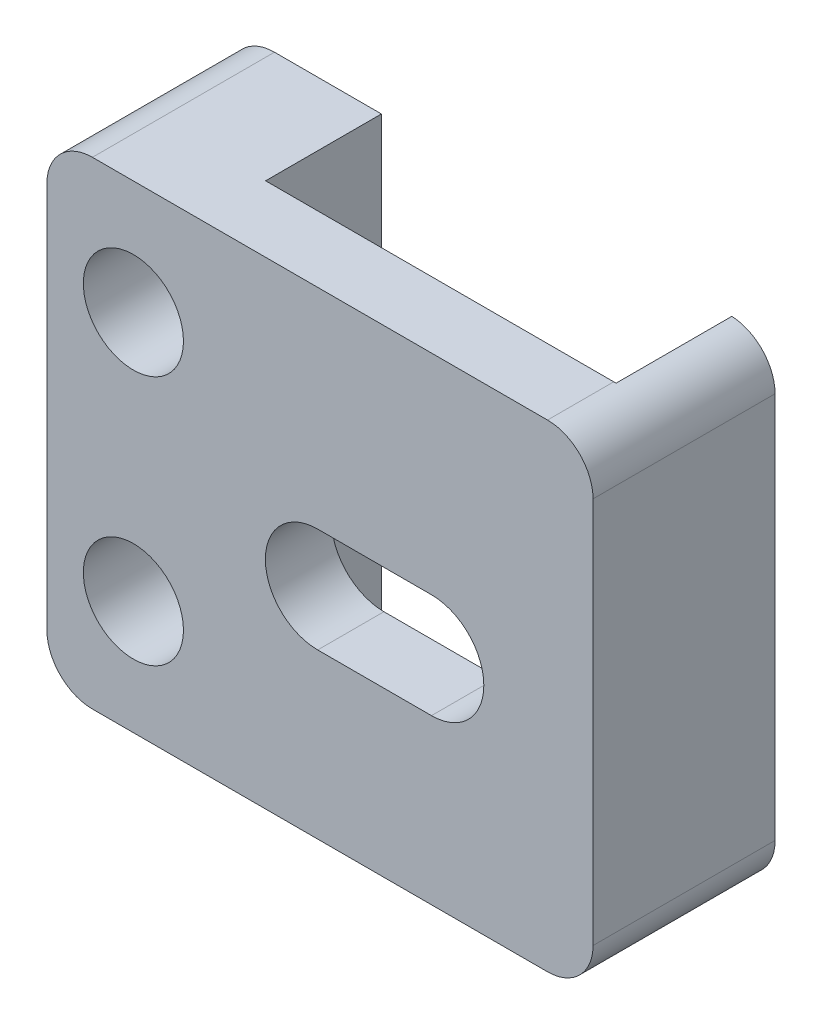
ISO-10303-21;
HEADER;
FILE_DESCRIPTION(('STEP AP214'),'2;1');
FILE_NAME('part.step','',(''),(''),'','','');
FILE_SCHEMA(('AUTOMOTIVE_DESIGN { 1 0 10303 214 1 1 1 1 }'));
ENDSEC;
DATA;
#1=APPLICATION_CONTEXT('core data for automotive mechanical design processes');
#2=APPLICATION_PROTOCOL_DEFINITION('international standard','automotive_design',2000,#1);
#3=PRODUCT_CONTEXT('',#1,'mechanical');
#4=PRODUCT('Part','Part','',(#3));
#5=PRODUCT_RELATED_PRODUCT_CATEGORY('part','',(#4));
#6=PRODUCT_DEFINITION_FORMATION('','',#4);
#7=PRODUCT_DEFINITION_CONTEXT('part definition',#1,'design');
#8=PRODUCT_DEFINITION('design','',#6,#7);
#9=PRODUCT_DEFINITION_SHAPE('','',#8);
#10=(LENGTH_UNIT() NAMED_UNIT(*) SI_UNIT(.MILLI.,.METRE.));
#11=(NAMED_UNIT(*) PLANE_ANGLE_UNIT() SI_UNIT($,.RADIAN.));
#12=(NAMED_UNIT(*) SI_UNIT($,.STERADIAN.) SOLID_ANGLE_UNIT());
#13=UNCERTAINTY_MEASURE_WITH_UNIT(LENGTH_MEASURE(1.E-05),#10,'distance_accuracy_value','');
#14=(GEOMETRIC_REPRESENTATION_CONTEXT(3) GLOBAL_UNCERTAINTY_ASSIGNED_CONTEXT((#13)) GLOBAL_UNIT_ASSIGNED_CONTEXT((#10,
#11,#12)) REPRESENTATION_CONTEXT('',''));
#15=CARTESIAN_POINT('',(0.,0.,0.));
#16=DIRECTION('',(0.,0.,1.));
#17=DIRECTION('',(1.,0.,0.));
#18=AXIS2_PLACEMENT_3D('',#15,#16,#17);
#19=CARTESIAN_POINT('',(0.,10.5,4.));
#20=DIRECTION('',(0.,0.,-1.));
#21=DIRECTION('',(-1.,0.,0.));
#22=AXIS2_PLACEMENT_3D('',#19,#20,#21);
#23=PLANE('',#22);
#24=DIRECTION('',(1.,0.,0.));
#25=VECTOR('',#24,1.);
#26=CARTESIAN_POINT('',(3.45,3.6,4.));
#27=LINE('',#26,#25);
#28=CARTESIAN_POINT('',(3.45,3.6,4.));
#29=VERTEX_POINT('',#28);
#30=CARTESIAN_POINT('',(5.95,3.6,4.));
#31=VERTEX_POINT('',#30);
#32=EDGE_CURVE('E157',#29,#31,#27,.T.);
#33=ORIENTED_EDGE('',*,*,#32,.F.);
#34=CARTESIAN_POINT('',(3.45,4.75,4.));
#35=DIRECTION('',(0.,0.,1.));
#36=DIRECTION('',(1.,0.,0.));
#37=AXIS2_PLACEMENT_3D('',#34,#35,#36);
#38=CIRCLE('',#37,1.15);
#39=CARTESIAN_POINT('',(3.45,5.9,4.));
#40=VERTEX_POINT('',#39);
#41=EDGE_CURVE('E47',#40,#29,#38,.T.);
#42=ORIENTED_EDGE('',*,*,#41,.F.);
#43=DIRECTION('',(-1.,0.,0.));
#44=VECTOR('',#43,1.);
#45=CARTESIAN_POINT('',(3.45,5.9,4.));
#46=LINE('',#45,#44);
#47=CARTESIAN_POINT('',(5.95,5.9,4.));
#48=VERTEX_POINT('',#47);
#49=EDGE_CURVE('E163',#48,#40,#46,.T.);
#50=ORIENTED_EDGE('',*,*,#49,.F.);
#51=CARTESIAN_POINT('',(5.95,4.75,4.));
#52=DIRECTION('',(0.,0.,1.));
#53=DIRECTION('',(1.,0.,0.));
#54=AXIS2_PLACEMENT_3D('',#51,#52,#53);
#55=CIRCLE('',#54,1.15);
#56=EDGE_CURVE('E148',#31,#48,#55,.T.);
#57=ORIENTED_EDGE('',*,*,#56,.F.);
#58=EDGE_LOOP('',(#33,#42,#50,#57));
#59=FACE_BOUND('',#58,.T.);
#60=CARTESIAN_POINT('',(-0.6,8.,4.));
#61=DIRECTION('',(0.,0.,1.));
#62=DIRECTION('',(1.,0.,0.));
#63=AXIS2_PLACEMENT_3D('',#60,#61,#62);
#64=CIRCLE('',#63,1.10000000000001);
#65=CARTESIAN_POINT('',(0.500000000000014,8.,4.));
#66=VERTEX_POINT('',#65);
#67=EDGE_CURVE('E175',#66,#66,#64,.T.);
#68=ORIENTED_EDGE('',*,*,#67,.F.);
#69=EDGE_LOOP('',(#68));
#70=FACE_BOUND('',#69,.T.);
#71=CARTESIAN_POINT('',(-0.6,2.5,4.));
#72=DIRECTION('',(0.,0.,1.));
#73=DIRECTION('',(1.,0.,0.));
#74=AXIS2_PLACEMENT_3D('',#71,#72,#73);
#75=CIRCLE('',#74,1.10000000000001);
#76=CARTESIAN_POINT('',(0.500000000000014,2.5,4.));
#77=VERTEX_POINT('',#76);
#78=EDGE_CURVE('E198',#77,#77,#75,.T.);
#79=ORIENTED_EDGE('',*,*,#78,.F.);
#80=EDGE_LOOP('',(#79));
#81=FACE_BOUND('',#80,.T.);
#82=DIRECTION('',(1.,0.,0.));
#83=VECTOR('',#82,1.);
#84=CARTESIAN_POINT('',(0.,0.,4.));
#85=LINE('',#84,#83);
#86=CARTESIAN_POINT('',(-1.5,0.,4.));
#87=VERTEX_POINT('',#86);
#88=CARTESIAN_POINT('',(8.5,0.,4.));
#89=VERTEX_POINT('',#88);
#90=EDGE_CURVE('E212',#87,#89,#85,.T.);
#91=ORIENTED_EDGE('',*,*,#90,.T.);
#92=CARTESIAN_POINT('',(8.5,0.999999999999999,4.));
#93=DIRECTION('',(0.,0.,-1.));
#94=DIRECTION('',(-1.,0.,0.));
#95=AXIS2_PLACEMENT_3D('',#92,#93,#94);
#96=CIRCLE('',#95,1.);
#97=CARTESIAN_POINT('',(9.5,1.,4.));
#98=VERTEX_POINT('',#97);
#99=EDGE_CURVE('E253',#89,#98,#96,.F.);
#100=ORIENTED_EDGE('',*,*,#99,.T.);
#101=DIRECTION('',(0.,-1.,0.));
#102=VECTOR('',#101,1.);
#103=CARTESIAN_POINT('',(9.5,10.5,4.));
#104=LINE('',#103,#102);
#105=CARTESIAN_POINT('',(9.5,9.5,4.));
#106=VERTEX_POINT('',#105);
#107=EDGE_CURVE('E226',#106,#98,#104,.T.);
#108=ORIENTED_EDGE('',*,*,#107,.F.);
#109=CARTESIAN_POINT('',(8.5,9.5,4.));
#110=DIRECTION('',(0.,0.,-1.));
#111=DIRECTION('',(-1.,0.,0.));
#112=AXIS2_PLACEMENT_3D('',#109,#110,#111);
#113=CIRCLE('',#112,1.);
#114=CARTESIAN_POINT('',(8.5,10.5,4.));
#115=VERTEX_POINT('',#114);
#116=EDGE_CURVE('E247',#106,#115,#113,.F.);
#117=ORIENTED_EDGE('',*,*,#116,.T.);
#118=DIRECTION('',(1.,0.,0.));
#119=VECTOR('',#118,1.);
#120=CARTESIAN_POINT('',(0.,10.5,4.));
#121=LINE('',#120,#119);
#122=CARTESIAN_POINT('',(-1.5,10.5,4.));
#123=VERTEX_POINT('',#122);
#124=EDGE_CURVE('E213',#123,#115,#121,.T.);
#125=ORIENTED_EDGE('',*,*,#124,.F.);
#126=CARTESIAN_POINT('',(-1.5,9.5,4.));
#127=DIRECTION('',(0.,0.,-1.));
#128=DIRECTION('',(-1.,0.,0.));
#129=AXIS2_PLACEMENT_3D('',#126,#127,#128);
#130=CIRCLE('',#129,1.);
#131=CARTESIAN_POINT('',(-2.5,9.5,4.));
#132=VERTEX_POINT('',#131);
#133=EDGE_CURVE('E249',#123,#132,#130,.F.);
#134=ORIENTED_EDGE('',*,*,#133,.T.);
#135=DIRECTION('',(0.,1.,0.));
#136=VECTOR('',#135,1.);
#137=CARTESIAN_POINT('',(-2.5,10.5,4.));
#138=LINE('',#137,#136);
#139=CARTESIAN_POINT('',(-2.5,1.,4.));
#140=VERTEX_POINT('',#139);
#141=EDGE_CURVE('E207',#140,#132,#138,.T.);
#142=ORIENTED_EDGE('',*,*,#141,.F.);
#143=CARTESIAN_POINT('',(-1.5,1.,4.));
#144=DIRECTION('',(0.,0.,-1.));
#145=DIRECTION('',(-1.,0.,0.));
#146=AXIS2_PLACEMENT_3D('',#143,#144,#145);
#147=CIRCLE('',#146,1.);
#148=EDGE_CURVE('E251',#140,#87,#147,.F.);
#149=ORIENTED_EDGE('',*,*,#148,.T.);
#150=EDGE_LOOP('',(#91,#100,#108,#117,#125,#134,#142,#149));
#151=FACE_BOUND('',#150,.T.);
#152=ADVANCED_FACE('F32',(#59,#70,#81,#151),#23,.F.);
#153=CARTESIAN_POINT('',(9.5,10.5,0.));
#154=DIRECTION('',(-1.,0.,0.));
#155=DIRECTION('',(0.,0.,1.));
#156=AXIS2_PLACEMENT_3D('',#153,#154,#155);
#157=PLANE('',#156);
#158=ORIENTED_EDGE('',*,*,#107,.T.);
#159=DIRECTION('',(0.,0.,-1.));
#160=VECTOR('',#159,1.);
#161=CARTESIAN_POINT('',(9.5,0.999999999999999,0.));
#162=LINE('',#161,#160);
#163=CARTESIAN_POINT('',(9.5,1.,0.));
#164=VERTEX_POINT('',#163);
#165=EDGE_CURVE('E231',#98,#164,#162,.T.);
#166=ORIENTED_EDGE('',*,*,#165,.T.);
#167=DIRECTION('',(0.,-1.,0.));
#168=VECTOR('',#167,1.);
#169=CARTESIAN_POINT('',(9.5,10.5,0.));
#170=LINE('',#169,#168);
#171=CARTESIAN_POINT('',(9.5,9.5,0.));
#172=VERTEX_POINT('',#171);
#173=EDGE_CURVE('E219',#172,#164,#170,.T.);
#174=ORIENTED_EDGE('',*,*,#173,.F.);
#175=DIRECTION('',(0.,0.,-1.));
#176=VECTOR('',#175,1.);
#177=CARTESIAN_POINT('',(9.5,9.5,4.));
#178=LINE('',#177,#176);
#179=EDGE_CURVE('E229',#172,#106,#178,.F.);
#180=ORIENTED_EDGE('',*,*,#179,.T.);
#181=EDGE_LOOP('',(#158,#166,#174,#180));
#182=FACE_BOUND('',#181,.T.);
#183=ADVANCED_FACE('F296',(#182),#157,.F.);
#184=CARTESIAN_POINT('',(0.,10.5,0.));
#185=DIRECTION('',(0.,0.,1.));
#186=DIRECTION('',(1.,0.,0.));
#187=AXIS2_PLACEMENT_3D('',#184,#185,#186);
#188=PLANE('',#187);
#189=CARTESIAN_POINT('',(-0.6,8.,0.));
#190=DIRECTION('',(0.,0.,1.));
#191=DIRECTION('',(1.,0.,0.));
#192=AXIS2_PLACEMENT_3D('',#189,#190,#191);
#193=CIRCLE('',#192,1.10000000000001);
#194=CARTESIAN_POINT('',(0.500000000000013,8.,0.));
#195=VERTEX_POINT('',#194);
#196=EDGE_CURVE('E195',#195,#195,#193,.T.);
#197=ORIENTED_EDGE('',*,*,#196,.T.);
#198=EDGE_LOOP('',(#197));
#199=FACE_BOUND('',#198,.T.);
#200=CARTESIAN_POINT('',(-0.6,2.5,0.));
#201=DIRECTION('',(0.,0.,1.));
#202=DIRECTION('',(1.,0.,0.));
#203=AXIS2_PLACEMENT_3D('',#200,#201,#202);
#204=CIRCLE('',#203,1.10000000000001);
#205=CARTESIAN_POINT('',(0.500000000000013,2.5,0.));
#206=VERTEX_POINT('',#205);
#207=EDGE_CURVE('E201',#206,#206,#204,.T.);
#208=ORIENTED_EDGE('',*,*,#207,.T.);
#209=EDGE_LOOP('',(#208));
#210=FACE_BOUND('',#209,.T.);
#211=DIRECTION('',(-1.,0.,0.));
#212=VECTOR('',#211,1.);
#213=CARTESIAN_POINT('',(0.,10.5,0.));
#214=LINE('',#213,#212);
#215=CARTESIAN_POINT('',(0.85,10.5,0.));
#216=VERTEX_POINT('',#215);
#217=CARTESIAN_POINT('',(-1.5,10.5,0.));
#218=VERTEX_POINT('',#217);
#219=EDGE_CURVE('E216',#216,#218,#214,.T.);
#220=ORIENTED_EDGE('',*,*,#219,.F.);
#221=DIRECTION('',(0.,1.,0.));
#222=VECTOR('',#221,1.);
#223=CARTESIAN_POINT('',(0.85,0.700000000000001,0.));
#224=LINE('',#223,#222);
#225=CARTESIAN_POINT('',(0.85,0.700000000000001,0.));
#226=VERTEX_POINT('',#225);
#227=EDGE_CURVE('E173',#226,#216,#224,.T.);
#228=ORIENTED_EDGE('',*,*,#227,.F.);
#229=DIRECTION('',(-1.,0.,0.));
#230=VECTOR('',#229,1.);
#231=CARTESIAN_POINT('',(8.55,0.700000000000001,0.));
#232=LINE('',#231,#230);
#233=CARTESIAN_POINT('',(8.55,0.700000000000001,0.));
#234=VERTEX_POINT('',#233);
#235=EDGE_CURVE('E176',#234,#226,#232,.T.);
#236=ORIENTED_EDGE('',*,*,#235,.F.);
#237=DIRECTION('',(0.,-1.,0.));
#238=VECTOR('',#237,1.);
#239=CARTESIAN_POINT('',(8.55,10.8,0.));
#240=LINE('',#239,#238);
#241=CARTESIAN_POINT('',(8.55,10.4987492177719,0.));
#242=VERTEX_POINT('',#241);
#243=EDGE_CURVE('E179',#242,#234,#240,.T.);
#244=ORIENTED_EDGE('',*,*,#243,.F.);
#245=CARTESIAN_POINT('',(8.5,9.5,0.));
#246=DIRECTION('',(0.,0.,1.));
#247=DIRECTION('',(1.,0.,0.));
#248=AXIS2_PLACEMENT_3D('',#245,#246,#247);
#249=CIRCLE('',#248,1.);
#250=EDGE_CURVE('E234',#242,#172,#249,.F.);
#251=ORIENTED_EDGE('',*,*,#250,.T.);
#252=ORIENTED_EDGE('',*,*,#173,.T.);
#253=CARTESIAN_POINT('',(8.5,0.999999999999999,0.));
#254=DIRECTION('',(0.,0.,1.));
#255=DIRECTION('',(1.,0.,0.));
#256=AXIS2_PLACEMENT_3D('',#253,#254,#255);
#257=CIRCLE('',#256,1.);
#258=CARTESIAN_POINT('',(8.5,0.,0.));
#259=VERTEX_POINT('',#258);
#260=EDGE_CURVE('E241',#164,#259,#257,.F.);
#261=ORIENTED_EDGE('',*,*,#260,.T.);
#262=DIRECTION('',(-1.,0.,0.));
#263=VECTOR('',#262,1.);
#264=CARTESIAN_POINT('',(0.,0.,0.));
#265=LINE('',#264,#263);
#266=CARTESIAN_POINT('',(-1.5,0.,0.));
#267=VERTEX_POINT('',#266);
#268=EDGE_CURVE('E217',#259,#267,#265,.T.);
#269=ORIENTED_EDGE('',*,*,#268,.T.);
#270=CARTESIAN_POINT('',(-1.5,1.,0.));
#271=DIRECTION('',(0.,0.,1.));
#272=DIRECTION('',(1.,0.,0.));
#273=AXIS2_PLACEMENT_3D('',#270,#271,#272);
#274=CIRCLE('',#273,1.);
#275=CARTESIAN_POINT('',(-2.5,1.,0.));
#276=VERTEX_POINT('',#275);
#277=EDGE_CURVE('E239',#267,#276,#274,.F.);
#278=ORIENTED_EDGE('',*,*,#277,.T.);
#279=DIRECTION('',(0.,-1.,0.));
#280=VECTOR('',#279,1.);
#281=CARTESIAN_POINT('',(-2.5,10.5,0.));
#282=LINE('',#281,#280);
#283=CARTESIAN_POINT('',(-2.5,9.5,0.));
#284=VERTEX_POINT('',#283);
#285=EDGE_CURVE('E204',#284,#276,#282,.T.);
#286=ORIENTED_EDGE('',*,*,#285,.F.);
#287=CARTESIAN_POINT('',(-1.5,9.5,0.));
#288=DIRECTION('',(0.,0.,1.));
#289=DIRECTION('',(1.,0.,0.));
#290=AXIS2_PLACEMENT_3D('',#287,#288,#289);
#291=CIRCLE('',#290,1.);
#292=EDGE_CURVE('E236',#284,#218,#291,.F.);
#293=ORIENTED_EDGE('',*,*,#292,.T.);
#294=EDGE_LOOP('',(#220,#228,#236,#244,#251,#252,#261,#269,#278,#286,#293));
#295=FACE_BOUND('',#294,.T.);
#296=ADVANCED_FACE('F301',(#199,#210,#295),#188,.F.);
#297=CARTESIAN_POINT('',(0.,10.5,0.));
#298=DIRECTION('',(0.,1.,0.));
#299=DIRECTION('',(0.,0.,1.));
#300=AXIS2_PLACEMENT_3D('',#297,#298,#299);
#301=PLANE('',#300);
#302=DIRECTION('',(0.,0.,1.));
#303=VECTOR('',#302,1.);
#304=CARTESIAN_POINT('',(0.85,10.5,0.));
#305=LINE('',#304,#303);
#306=CARTESIAN_POINT('',(0.85,10.5,2.54483655126592));
#307=VERTEX_POINT('',#306);
#308=EDGE_CURVE('E270',#216,#307,#305,.T.);
#309=ORIENTED_EDGE('',*,*,#308,.F.);
#310=ORIENTED_EDGE('',*,*,#219,.T.);
#311=DIRECTION('',(0.,0.,-1.));
#312=VECTOR('',#311,1.);
#313=CARTESIAN_POINT('',(-1.5,10.5,0.));
#314=LINE('',#313,#312);
#315=EDGE_CURVE('E264',#218,#123,#314,.F.);
#316=ORIENTED_EDGE('',*,*,#315,.T.);
#317=ORIENTED_EDGE('',*,*,#124,.T.);
#318=DIRECTION('',(0.,0.,-1.));
#319=VECTOR('',#318,1.);
#320=CARTESIAN_POINT('',(8.5,10.5,0.));
#321=LINE('',#320,#319);
#322=CARTESIAN_POINT('',(8.5,10.5,2.54483655126592));
#323=VERTEX_POINT('',#322);
#324=EDGE_CURVE('E261',#115,#323,#321,.T.);
#325=ORIENTED_EDGE('',*,*,#324,.T.);
#326=DIRECTION('',(1.,0.,0.));
#327=VECTOR('',#326,1.);
#328=CARTESIAN_POINT('',(8.25,10.5,2.54483655126592));
#329=LINE('',#328,#327);
#330=EDGE_CURVE('E210',#307,#323,#329,.T.);
#331=ORIENTED_EDGE('',*,*,#330,.F.);
#332=EDGE_LOOP('',(#309,#310,#316,#317,#325,#331));
#333=FACE_BOUND('',#332,.T.);
#334=ADVANCED_FACE('F350',(#333),#301,.T.);
#335=CARTESIAN_POINT('',(0.,0.,0.));
#336=DIRECTION('',(0.,1.,0.));
#337=DIRECTION('',(0.,0.,1.));
#338=AXIS2_PLACEMENT_3D('',#335,#336,#337);
#339=PLANE('',#338);
#340=ORIENTED_EDGE('',*,*,#268,.F.);
#341=DIRECTION('',(0.,0.,-1.));
#342=VECTOR('',#341,1.);
#343=CARTESIAN_POINT('',(8.5,0.,0.));
#344=LINE('',#343,#342);
#345=EDGE_CURVE('E245',#259,#89,#344,.F.);
#346=ORIENTED_EDGE('',*,*,#345,.T.);
#347=ORIENTED_EDGE('',*,*,#90,.F.);
#348=DIRECTION('',(0.,0.,1.));
#349=VECTOR('',#348,1.);
#350=CARTESIAN_POINT('',(-1.5,0.,0.));
#351=LINE('',#350,#349);
#352=EDGE_CURVE('E243',#87,#267,#351,.F.);
#353=ORIENTED_EDGE('',*,*,#352,.T.);
#354=EDGE_LOOP('',(#340,#346,#347,#353));
#355=FACE_BOUND('',#354,.T.);
#356=ADVANCED_FACE('F337',(#355),#339,.F.);
#357=CARTESIAN_POINT('',(8.25,1.,2.54483655126592));
#358=DIRECTION('',(0.,0.,1.));
#359=DIRECTION('',(1.,0.,0.));
#360=AXIS2_PLACEMENT_3D('',#357,#358,#359);
#361=PLANE('',#360);
#362=DIRECTION('',(-1.,0.,0.));
#363=VECTOR('',#362,1.);
#364=CARTESIAN_POINT('',(8.25,5.9,2.54483655126592));
#365=LINE('',#364,#363);
#366=CARTESIAN_POINT('',(5.95,5.9,2.54483655126592));
#367=VERTEX_POINT('',#366);
#368=CARTESIAN_POINT('',(3.45,5.9,2.54483655126592));
#369=VERTEX_POINT('',#368);
#370=EDGE_CURVE('E40',#367,#369,#365,.T.);
#371=ORIENTED_EDGE('',*,*,#370,.T.);
#372=CARTESIAN_POINT('',(3.45,4.75,2.54483655126592));
#373=DIRECTION('',(0.,0.,1.));
#374=DIRECTION('',(1.,0.,0.));
#375=AXIS2_PLACEMENT_3D('',#372,#373,#374);
#376=CIRCLE('',#375,1.15);
#377=CARTESIAN_POINT('',(3.45,3.6,2.54483655126592));
#378=VERTEX_POINT('',#377);
#379=EDGE_CURVE('E11',#369,#378,#376,.T.);
#380=ORIENTED_EDGE('',*,*,#379,.T.);
#381=DIRECTION('',(1.,0.,0.));
#382=VECTOR('',#381,1.);
#383=CARTESIAN_POINT('',(8.25,3.6,2.54483655126592));
#384=LINE('',#383,#382);
#385=CARTESIAN_POINT('',(5.95,3.6,2.54483655126592));
#386=VERTEX_POINT('',#385);
#387=EDGE_CURVE('E273',#378,#386,#384,.T.);
#388=ORIENTED_EDGE('',*,*,#387,.T.);
#389=CARTESIAN_POINT('',(5.95,4.75,2.54483655126592));
#390=DIRECTION('',(0.,0.,1.));
#391=DIRECTION('',(1.,0.,0.));
#392=AXIS2_PLACEMENT_3D('',#389,#390,#391);
#393=CIRCLE('',#392,1.15);
#394=EDGE_CURVE('E151',#386,#367,#393,.T.);
#395=ORIENTED_EDGE('',*,*,#394,.T.);
#396=EDGE_LOOP('',(#371,#380,#388,#395));
#397=FACE_BOUND('',#396,.T.);
#398=ORIENTED_EDGE('',*,*,#330,.T.);
#399=CARTESIAN_POINT('',(8.5,9.5,2.54483655126592));
#400=DIRECTION('',(0.,0.,1.));
#401=DIRECTION('',(1.,0.,0.));
#402=AXIS2_PLACEMENT_3D('',#399,#400,#401);
#403=CIRCLE('',#402,1.);
#404=CARTESIAN_POINT('',(8.55,10.4987492177719,2.54483655126592));
#405=VERTEX_POINT('',#404);
#406=EDGE_CURVE('E266',#323,#405,#403,.F.);
#407=ORIENTED_EDGE('',*,*,#406,.T.);
#408=DIRECTION('',(0.,-1.,0.));
#409=VECTOR('',#408,1.);
#410=CARTESIAN_POINT('',(8.55,10.8,2.54483655126592));
#411=LINE('',#410,#409);
#412=CARTESIAN_POINT('',(8.55,0.700000000000001,2.54483655126592));
#413=VERTEX_POINT('',#412);
#414=EDGE_CURVE('E182',#405,#413,#411,.T.);
#415=ORIENTED_EDGE('',*,*,#414,.T.);
#416=DIRECTION('',(-1.,0.,0.));
#417=VECTOR('',#416,1.);
#418=CARTESIAN_POINT('',(8.55,0.700000000000001,2.54483655126592));
#419=LINE('',#418,#417);
#420=CARTESIAN_POINT('',(0.85,0.700000000000001,2.54483655126592));
#421=VERTEX_POINT('',#420);
#422=EDGE_CURVE('E187',#413,#421,#419,.T.);
#423=ORIENTED_EDGE('',*,*,#422,.T.);
#424=DIRECTION('',(0.,1.,0.));
#425=VECTOR('',#424,1.);
#426=CARTESIAN_POINT('',(0.85,0.700000000000001,2.54483655126592));
#427=LINE('',#426,#425);
#428=EDGE_CURVE('E170',#421,#307,#427,.T.);
#429=ORIENTED_EDGE('',*,*,#428,.T.);
#430=EDGE_LOOP('',(#398,#407,#415,#423,#429));
#431=FACE_BOUND('',#430,.T.);
#432=ADVANCED_FACE('F277',(#397,#431),#361,.F.);
#433=CARTESIAN_POINT('',(-2.5,0.,0.));
#434=DIRECTION('',(-1.,0.,0.));
#435=DIRECTION('',(0.,0.,1.));
#436=AXIS2_PLACEMENT_3D('',#433,#434,#435);
#437=PLANE('',#436);
#438=ORIENTED_EDGE('',*,*,#285,.T.);
#439=DIRECTION('',(0.,0.,1.));
#440=VECTOR('',#439,1.);
#441=CARTESIAN_POINT('',(-2.5,1.,4.));
#442=LINE('',#441,#440);
#443=EDGE_CURVE('E258',#276,#140,#442,.T.);
#444=ORIENTED_EDGE('',*,*,#443,.T.);
#445=ORIENTED_EDGE('',*,*,#141,.T.);
#446=DIRECTION('',(0.,0.,-1.));
#447=VECTOR('',#446,1.);
#448=CARTESIAN_POINT('',(-2.5,9.5,0.));
#449=LINE('',#448,#447);
#450=EDGE_CURVE('E255',#132,#284,#449,.T.);
#451=ORIENTED_EDGE('',*,*,#450,.T.);
#452=EDGE_LOOP('',(#438,#444,#445,#451));
#453=FACE_BOUND('',#452,.T.);
#454=ADVANCED_FACE('F310',(#453),#437,.T.);
#455=CARTESIAN_POINT('',(8.5,0.999999999999999,0.));
#456=DIRECTION('',(0.,0.,-1.));
#457=DIRECTION('',(-1.,0.,0.));
#458=AXIS2_PLACEMENT_3D('',#455,#456,#457);
#459=CYLINDRICAL_SURFACE('',#458,1.);
#460=ORIENTED_EDGE('',*,*,#99,.F.);
#461=ORIENTED_EDGE('',*,*,#345,.F.);
#462=ORIENTED_EDGE('',*,*,#260,.F.);
#463=ORIENTED_EDGE('',*,*,#165,.F.);
#464=EDGE_LOOP('',(#460,#461,#462,#463));
#465=FACE_BOUND('',#464,.T.);
#466=ADVANCED_FACE('F306',(#465),#459,.T.);
#467=CARTESIAN_POINT('',(-1.5,1.,0.));
#468=DIRECTION('',(0.,0.,-1.));
#469=DIRECTION('',(-1.,0.,0.));
#470=AXIS2_PLACEMENT_3D('',#467,#468,#469);
#471=CYLINDRICAL_SURFACE('',#470,1.);
#472=ORIENTED_EDGE('',*,*,#277,.F.);
#473=ORIENTED_EDGE('',*,*,#352,.F.);
#474=ORIENTED_EDGE('',*,*,#148,.F.);
#475=ORIENTED_EDGE('',*,*,#443,.F.);
#476=EDGE_LOOP('',(#472,#473,#474,#475));
#477=FACE_BOUND('',#476,.T.);
#478=ADVANCED_FACE('F309',(#477),#471,.T.);
#479=CARTESIAN_POINT('',(-1.5,9.5,0.));
#480=DIRECTION('',(0.,0.,-1.));
#481=DIRECTION('',(-1.,0.,0.));
#482=AXIS2_PLACEMENT_3D('',#479,#480,#481);
#483=CYLINDRICAL_SURFACE('',#482,1.);
#484=ORIENTED_EDGE('',*,*,#133,.F.);
#485=ORIENTED_EDGE('',*,*,#315,.F.);
#486=ORIENTED_EDGE('',*,*,#292,.F.);
#487=ORIENTED_EDGE('',*,*,#450,.F.);
#488=EDGE_LOOP('',(#484,#485,#486,#487));
#489=FACE_BOUND('',#488,.T.);
#490=ADVANCED_FACE('F313',(#489),#483,.T.);
#491=CARTESIAN_POINT('',(8.5,9.5,0.));
#492=DIRECTION('',(0.,0.,1.));
#493=DIRECTION('',(1.,0.,0.));
#494=AXIS2_PLACEMENT_3D('',#491,#492,#493);
#495=CYLINDRICAL_SURFACE('',#494,1.);
#496=DIRECTION('',(0.,0.,1.));
#497=VECTOR('',#496,1.);
#498=CARTESIAN_POINT('',(8.55,10.4987492177719,0.));
#499=LINE('',#498,#497);
#500=EDGE_CURVE('E268',#405,#242,#499,.F.);
#501=ORIENTED_EDGE('',*,*,#500,.F.);
#502=ORIENTED_EDGE('',*,*,#406,.F.);
#503=ORIENTED_EDGE('',*,*,#324,.F.);
#504=ORIENTED_EDGE('',*,*,#116,.F.);
#505=ORIENTED_EDGE('',*,*,#179,.F.);
#506=ORIENTED_EDGE('',*,*,#250,.F.);
#507=EDGE_LOOP('',(#501,#502,#503,#504,#505,#506));
#508=FACE_BOUND('',#507,.T.);
#509=ADVANCED_FACE('F34',(#508),#495,.T.);
#510=CARTESIAN_POINT('',(-0.6,2.5,4.));
#511=DIRECTION('',(0.,0.,1.));
#512=DIRECTION('',(1.,0.,0.));
#513=AXIS2_PLACEMENT_3D('',#510,#511,#512);
#514=CYLINDRICAL_SURFACE('',#513,1.10000000000001);
#515=ORIENTED_EDGE('',*,*,#207,.F.);
#516=EDGE_LOOP('',(#515));
#517=FACE_BOUND('',#516,.T.);
#518=ORIENTED_EDGE('',*,*,#78,.T.);
#519=EDGE_LOOP('',(#518));
#520=FACE_BOUND('',#519,.T.);
#521=ADVANCED_FACE('F320',(#517,#520),#514,.F.);
#522=CARTESIAN_POINT('',(-0.6,8.,4.));
#523=DIRECTION('',(0.,0.,1.));
#524=DIRECTION('',(1.,0.,0.));
#525=AXIS2_PLACEMENT_3D('',#522,#523,#524);
#526=CYLINDRICAL_SURFACE('',#525,1.10000000000001);
#527=ORIENTED_EDGE('',*,*,#196,.F.);
#528=EDGE_LOOP('',(#527));
#529=FACE_BOUND('',#528,.T.);
#530=ORIENTED_EDGE('',*,*,#67,.T.);
#531=EDGE_LOOP('',(#530));
#532=FACE_BOUND('',#531,.T.);
#533=ADVANCED_FACE('F364',(#529,#532),#526,.F.);
#534=CARTESIAN_POINT('',(0.85,0.700000000000001,15.2452302459511));
#535=DIRECTION('',(-1.,0.,0.));
#536=DIRECTION('',(0.,0.,1.));
#537=AXIS2_PLACEMENT_3D('',#534,#535,#536);
#538=PLANE('',#537);
#539=ORIENTED_EDGE('',*,*,#308,.T.);
#540=ORIENTED_EDGE('',*,*,#428,.F.);
#541=DIRECTION('',(0.,0.,-1.));
#542=VECTOR('',#541,1.);
#543=CARTESIAN_POINT('',(0.85,0.700000000000001,15.2452302459511));
#544=LINE('',#543,#542);
#545=EDGE_CURVE('E184',#421,#226,#544,.T.);
#546=ORIENTED_EDGE('',*,*,#545,.T.);
#547=ORIENTED_EDGE('',*,*,#227,.T.);
#548=EDGE_LOOP('',(#539,#540,#546,#547));
#549=FACE_BOUND('',#548,.T.);
#550=ADVANCED_FACE('F362',(#549),#538,.F.);
#551=CARTESIAN_POINT('',(8.55,0.700000000000001,15.2452302459511));
#552=DIRECTION('',(0.,-1.,0.));
#553=DIRECTION('',(0.,0.,-1.));
#554=AXIS2_PLACEMENT_3D('',#551,#552,#553);
#555=PLANE('',#554);
#556=DIRECTION('',(0.,0.,-1.));
#557=VECTOR('',#556,1.);
#558=CARTESIAN_POINT('',(8.55,0.700000000000001,15.2452302459511));
#559=LINE('',#558,#557);
#560=EDGE_CURVE('E181',#413,#234,#559,.T.);
#561=ORIENTED_EDGE('',*,*,#560,.T.);
#562=ORIENTED_EDGE('',*,*,#235,.T.);
#563=ORIENTED_EDGE('',*,*,#545,.F.);
#564=ORIENTED_EDGE('',*,*,#422,.F.);
#565=EDGE_LOOP('',(#561,#562,#563,#564));
#566=FACE_BOUND('',#565,.T.);
#567=ADVANCED_FACE('F291',(#566),#555,.F.);
#568=CARTESIAN_POINT('',(8.55,10.8,15.2452302459511));
#569=DIRECTION('',(1.,0.,0.));
#570=DIRECTION('',(0.,0.,-1.));
#571=AXIS2_PLACEMENT_3D('',#568,#569,#570);
#572=PLANE('',#571);
#573=ORIENTED_EDGE('',*,*,#500,.T.);
#574=ORIENTED_EDGE('',*,*,#243,.T.);
#575=ORIENTED_EDGE('',*,*,#560,.F.);
#576=ORIENTED_EDGE('',*,*,#414,.F.);
#577=EDGE_LOOP('',(#573,#574,#575,#576));
#578=FACE_BOUND('',#577,.T.);
#579=ADVANCED_FACE('F284',(#578),#572,.F.);
#580=CARTESIAN_POINT('',(3.45,4.75,2.54));
#581=DIRECTION('',(0.,0.,1.));
#582=DIRECTION('',(1.,0.,0.));
#583=AXIS2_PLACEMENT_3D('',#580,#581,#582);
#584=CYLINDRICAL_SURFACE('',#583,1.15);
#585=DIRECTION('',(0.,0.,1.));
#586=VECTOR('',#585,1.);
#587=CARTESIAN_POINT('',(3.45,5.9,2.54));
#588=LINE('',#587,#586);
#589=EDGE_CURVE('E168',#369,#40,#588,.T.);
#590=ORIENTED_EDGE('',*,*,#589,.T.);
#591=ORIENTED_EDGE('',*,*,#41,.T.);
#592=DIRECTION('',(0.,0.,1.));
#593=VECTOR('',#592,1.);
#594=CARTESIAN_POINT('',(3.45,3.6,2.54));
#595=LINE('',#594,#593);
#596=EDGE_CURVE('E154',#378,#29,#595,.T.);
#597=ORIENTED_EDGE('',*,*,#596,.F.);
#598=ORIENTED_EDGE('',*,*,#379,.F.);
#599=EDGE_LOOP('',(#590,#591,#597,#598));
#600=FACE_BOUND('',#599,.T.);
#601=ADVANCED_FACE('F282',(#600),#584,.F.);
#602=CARTESIAN_POINT('',(3.45,5.9,2.54));
#603=DIRECTION('',(0.,1.,0.));
#604=DIRECTION('',(-1.,0.,0.));
#605=AXIS2_PLACEMENT_3D('',#602,#603,#604);
#606=PLANE('',#605);
#607=DIRECTION('',(0.,0.,1.));
#608=VECTOR('',#607,1.);
#609=CARTESIAN_POINT('',(5.95,5.9,2.54));
#610=LINE('',#609,#608);
#611=EDGE_CURVE('E153',#367,#48,#610,.T.);
#612=ORIENTED_EDGE('',*,*,#611,.T.);
#613=ORIENTED_EDGE('',*,*,#49,.T.);
#614=ORIENTED_EDGE('',*,*,#589,.F.);
#615=ORIENTED_EDGE('',*,*,#370,.F.);
#616=EDGE_LOOP('',(#612,#613,#614,#615));
#617=FACE_BOUND('',#616,.T.);
#618=ADVANCED_FACE('F281',(#617),#606,.F.);
#619=CARTESIAN_POINT('',(5.95,4.75,2.54));
#620=DIRECTION('',(0.,0.,1.));
#621=DIRECTION('',(1.,0.,0.));
#622=AXIS2_PLACEMENT_3D('',#619,#620,#621);
#623=CYLINDRICAL_SURFACE('',#622,1.15);
#624=DIRECTION('',(0.,0.,1.));
#625=VECTOR('',#624,1.);
#626=CARTESIAN_POINT('',(5.95,3.6,2.54));
#627=LINE('',#626,#625);
#628=EDGE_CURVE('E55',#386,#31,#627,.T.);
#629=ORIENTED_EDGE('',*,*,#628,.T.);
#630=ORIENTED_EDGE('',*,*,#56,.T.);
#631=ORIENTED_EDGE('',*,*,#611,.F.);
#632=ORIENTED_EDGE('',*,*,#394,.F.);
#633=EDGE_LOOP('',(#629,#630,#631,#632));
#634=FACE_BOUND('',#633,.T.);
#635=ADVANCED_FACE('F145',(#634),#623,.F.);
#636=CARTESIAN_POINT('',(3.45,3.6,2.54));
#637=DIRECTION('',(0.,-1.,0.));
#638=DIRECTION('',(1.,0.,0.));
#639=AXIS2_PLACEMENT_3D('',#636,#637,#638);
#640=PLANE('',#639);
#641=ORIENTED_EDGE('',*,*,#596,.T.);
#642=ORIENTED_EDGE('',*,*,#32,.T.);
#643=ORIENTED_EDGE('',*,*,#628,.F.);
#644=ORIENTED_EDGE('',*,*,#387,.F.);
#645=EDGE_LOOP('',(#641,#642,#643,#644));
#646=FACE_BOUND('',#645,.T.);
#647=ADVANCED_FACE('F158',(#646),#640,.F.);
#648=CLOSED_SHELL('',(#152,#183,#296,#334,#356,#432,#454,#466,#478,#490,#509,#521,#533,#550,
#567,#579,#601,#618,#635,#647));
#649=MANIFOLD_SOLID_BREP('B2',#648);
#650=ADVANCED_BREP_SHAPE_REPRESENTATION('',(#18,#649),#14);
#651=SHAPE_DEFINITION_REPRESENTATION(#9,#650);
ENDSEC;
END-ISO-10303-21;
